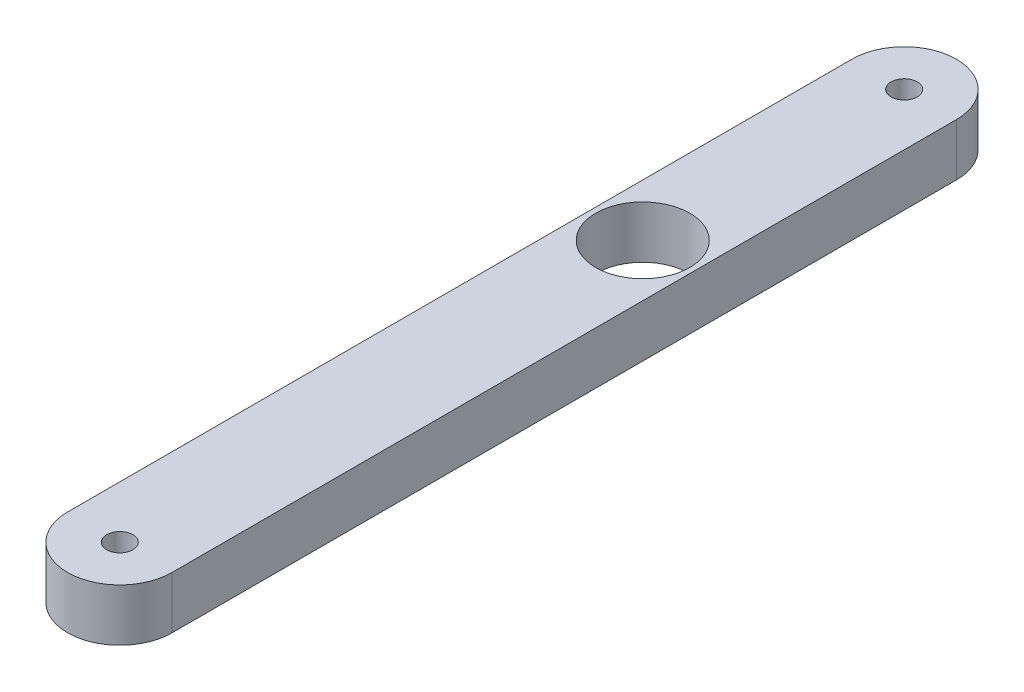
ISO-10303-21;
HEADER;
FILE_DESCRIPTION(('STEP AP214'),'2;1');
FILE_NAME('part.step','',(''),(''),'','','');
FILE_SCHEMA(('AUTOMOTIVE_DESIGN { 1 0 10303 214 1 1 1 1 }'));
ENDSEC;
DATA;
#1=APPLICATION_CONTEXT('core data for automotive mechanical design processes');
#2=APPLICATION_PROTOCOL_DEFINITION('international standard','automotive_design',2000,#1);
#3=PRODUCT_CONTEXT('',#1,'mechanical');
#4=PRODUCT('Part','Part','',(#3));
#5=PRODUCT_RELATED_PRODUCT_CATEGORY('part','',(#4));
#6=PRODUCT_DEFINITION_FORMATION('','',#4);
#7=PRODUCT_DEFINITION_CONTEXT('part definition',#1,'design');
#8=PRODUCT_DEFINITION('design','',#6,#7);
#9=PRODUCT_DEFINITION_SHAPE('','',#8);
#10=(LENGTH_UNIT() NAMED_UNIT(*) SI_UNIT(.MILLI.,.METRE.));
#11=(NAMED_UNIT(*) PLANE_ANGLE_UNIT() SI_UNIT($,.RADIAN.));
#12=(NAMED_UNIT(*) SI_UNIT($,.STERADIAN.) SOLID_ANGLE_UNIT());
#13=UNCERTAINTY_MEASURE_WITH_UNIT(LENGTH_MEASURE(1.E-05),#10,'distance_accuracy_value','');
#14=(GEOMETRIC_REPRESENTATION_CONTEXT(3) GLOBAL_UNCERTAINTY_ASSIGNED_CONTEXT((#13)) GLOBAL_UNIT_ASSIGNED_CONTEXT((#10,
#11,#12)) REPRESENTATION_CONTEXT('',''));
#15=CARTESIAN_POINT('',(0.,0.,0.));
#16=DIRECTION('',(0.,0.,1.));
#17=DIRECTION('',(1.,0.,0.));
#18=AXIS2_PLACEMENT_3D('',#15,#16,#17);
#19=CARTESIAN_POINT('',(10.,10.,0.));
#20=DIRECTION('',(-1.,0.,0.));
#21=DIRECTION('',(0.,0.,1.));
#22=AXIS2_PLACEMENT_3D('',#19,#20,#21);
#23=PLANE('',#22);
#24=DIRECTION('',(0.,0.,-1.));
#25=VECTOR('',#24,1.);
#26=CARTESIAN_POINT('',(10.,0.,0.));
#27=LINE('',#26,#25);
#28=CARTESIAN_POINT('',(10.,0.,75.));
#29=VERTEX_POINT('',#28);
#30=CARTESIAN_POINT('',(10.,0.,-75.));
#31=VERTEX_POINT('',#30);
#32=EDGE_CURVE('E106',#29,#31,#27,.T.);
#33=ORIENTED_EDGE('',*,*,#32,.T.);
#34=DIRECTION('',(0.,-1.,0.));
#35=VECTOR('',#34,1.);
#36=CARTESIAN_POINT('',(10.,10.,-75.));
#37=LINE('',#36,#35);
#38=CARTESIAN_POINT('',(10.,10.,-75.));
#39=VERTEX_POINT('',#38);
#40=EDGE_CURVE('E11',#39,#31,#37,.T.);
#41=ORIENTED_EDGE('',*,*,#40,.F.);
#42=DIRECTION('',(0.,0.,-1.));
#43=VECTOR('',#42,1.);
#44=CARTESIAN_POINT('',(10.,10.,0.));
#45=LINE('',#44,#43);
#46=CARTESIAN_POINT('',(10.,10.,75.));
#47=VERTEX_POINT('',#46);
#48=EDGE_CURVE('E86',#47,#39,#45,.T.);
#49=ORIENTED_EDGE('',*,*,#48,.F.);
#50=DIRECTION('',(0.,-1.,0.));
#51=VECTOR('',#50,1.);
#52=CARTESIAN_POINT('',(10.,10.,75.));
#53=LINE('',#52,#51);
#54=EDGE_CURVE('E52',#47,#29,#53,.T.);
#55=ORIENTED_EDGE('',*,*,#54,.T.);
#56=EDGE_LOOP('',(#33,#41,#49,#55));
#57=FACE_BOUND('',#56,.T.);
#58=ADVANCED_FACE('F35',(#57),#23,.F.);
#59=CARTESIAN_POINT('',(0.,10.,-75.));
#60=DIRECTION('',(0.,-1.,0.));
#61=DIRECTION('',(0.,0.,-1.));
#62=AXIS2_PLACEMENT_3D('',#59,#60,#61);
#63=CYLINDRICAL_SURFACE('',#62,10.);
#64=CARTESIAN_POINT('',(0.,0.,-75.));
#65=DIRECTION('',(0.,1.,0.));
#66=DIRECTION('',(0.,0.,1.));
#67=AXIS2_PLACEMENT_3D('',#64,#65,#66);
#68=CIRCLE('',#67,10.);
#69=CARTESIAN_POINT('',(-10.,0.,-75.));
#70=VERTEX_POINT('',#69);
#71=EDGE_CURVE('E91',#31,#70,#68,.T.);
#72=ORIENTED_EDGE('',*,*,#71,.T.);
#73=DIRECTION('',(0.,-1.,0.));
#74=VECTOR('',#73,1.);
#75=CARTESIAN_POINT('',(-10.,10.,-75.));
#76=LINE('',#75,#74);
#77=CARTESIAN_POINT('',(-10.,10.,-75.));
#78=VERTEX_POINT('',#77);
#79=EDGE_CURVE('E44',#78,#70,#76,.T.);
#80=ORIENTED_EDGE('',*,*,#79,.F.);
#81=CARTESIAN_POINT('',(0.,10.,-75.));
#82=DIRECTION('',(0.,1.,0.));
#83=DIRECTION('',(0.,0.,1.));
#84=AXIS2_PLACEMENT_3D('',#81,#82,#83);
#85=CIRCLE('',#84,10.);
#86=EDGE_CURVE('E77',#39,#78,#85,.T.);
#87=ORIENTED_EDGE('',*,*,#86,.F.);
#88=ORIENTED_EDGE('',*,*,#40,.T.);
#89=EDGE_LOOP('',(#72,#80,#87,#88));
#90=FACE_BOUND('',#89,.T.);
#91=ADVANCED_FACE('F90',(#90),#63,.T.);
#92=CARTESIAN_POINT('',(-10.,10.,0.));
#93=DIRECTION('',(-1.,0.,0.));
#94=DIRECTION('',(0.,0.,1.));
#95=AXIS2_PLACEMENT_3D('',#92,#93,#94);
#96=PLANE('',#95);
#97=DIRECTION('',(0.,0.,-1.));
#98=VECTOR('',#97,1.);
#99=CARTESIAN_POINT('',(-10.,0.,0.));
#100=LINE('',#99,#98);
#101=CARTESIAN_POINT('',(-10.,0.,75.));
#102=VERTEX_POINT('',#101);
#103=EDGE_CURVE('E110',#102,#70,#100,.T.);
#104=ORIENTED_EDGE('',*,*,#103,.F.);
#105=DIRECTION('',(0.,-1.,0.));
#106=VECTOR('',#105,1.);
#107=CARTESIAN_POINT('',(-10.,10.,75.));
#108=LINE('',#107,#106);
#109=CARTESIAN_POINT('',(-10.,10.,75.));
#110=VERTEX_POINT('',#109);
#111=EDGE_CURVE('E66',#110,#102,#108,.T.);
#112=ORIENTED_EDGE('',*,*,#111,.F.);
#113=DIRECTION('',(0.,0.,-1.));
#114=VECTOR('',#113,1.);
#115=CARTESIAN_POINT('',(-10.,10.,0.));
#116=LINE('',#115,#114);
#117=EDGE_CURVE('E85',#110,#78,#116,.T.);
#118=ORIENTED_EDGE('',*,*,#117,.T.);
#119=ORIENTED_EDGE('',*,*,#79,.T.);
#120=EDGE_LOOP('',(#104,#112,#118,#119));
#121=FACE_BOUND('',#120,.T.);
#122=ADVANCED_FACE('F94',(#121),#96,.T.);
#123=CARTESIAN_POINT('',(0.,10.,75.));
#124=DIRECTION('',(0.,-1.,0.));
#125=DIRECTION('',(0.,0.,-1.));
#126=AXIS2_PLACEMENT_3D('',#123,#124,#125);
#127=CYLINDRICAL_SURFACE('',#126,10.);
#128=CARTESIAN_POINT('',(0.,0.,75.));
#129=DIRECTION('',(0.,1.,0.));
#130=DIRECTION('',(0.,0.,1.));
#131=AXIS2_PLACEMENT_3D('',#128,#129,#130);
#132=CIRCLE('',#131,10.);
#133=EDGE_CURVE('E112',#29,#102,#132,.F.);
#134=ORIENTED_EDGE('',*,*,#133,.F.);
#135=ORIENTED_EDGE('',*,*,#54,.F.);
#136=CARTESIAN_POINT('',(0.,10.,75.));
#137=DIRECTION('',(0.,1.,0.));
#138=DIRECTION('',(0.,0.,1.));
#139=AXIS2_PLACEMENT_3D('',#136,#137,#138);
#140=CIRCLE('',#139,10.);
#141=EDGE_CURVE('E95',#47,#110,#140,.F.);
#142=ORIENTED_EDGE('',*,*,#141,.T.);
#143=ORIENTED_EDGE('',*,*,#111,.T.);
#144=EDGE_LOOP('',(#134,#135,#142,#143));
#145=FACE_BOUND('',#144,.T.);
#146=ADVANCED_FACE('F160',(#145),#127,.T.);
#147=CARTESIAN_POINT('',(0.,10.,75.));
#148=DIRECTION('',(0.,-1.,0.));
#149=DIRECTION('',(0.,0.,-1.));
#150=AXIS2_PLACEMENT_3D('',#147,#148,#149);
#151=CYLINDRICAL_SURFACE('',#150,2.50000000000001);
#152=CARTESIAN_POINT('',(0.,10.,75.));
#153=DIRECTION('',(0.,1.,0.));
#154=DIRECTION('',(0.,0.,1.));
#155=AXIS2_PLACEMENT_3D('',#152,#153,#154);
#156=CIRCLE('',#155,2.50000000000001);
#157=CARTESIAN_POINT('',(0.,10.,77.5));
#158=VERTEX_POINT('',#157);
#159=EDGE_CURVE('E118',#158,#158,#156,.F.);
#160=ORIENTED_EDGE('',*,*,#159,.F.);
#161=EDGE_LOOP('',(#160));
#162=FACE_BOUND('',#161,.T.);
#163=CARTESIAN_POINT('',(0.,0.,75.));
#164=DIRECTION('',(0.,1.,0.));
#165=DIRECTION('',(0.,0.,1.));
#166=AXIS2_PLACEMENT_3D('',#163,#164,#165);
#167=CIRCLE('',#166,2.50000000000001);
#168=CARTESIAN_POINT('',(0.,0.,77.5));
#169=VERTEX_POINT('',#168);
#170=EDGE_CURVE('E103',#169,#169,#167,.F.);
#171=ORIENTED_EDGE('',*,*,#170,.T.);
#172=EDGE_LOOP('',(#171));
#173=FACE_BOUND('',#172,.T.);
#174=ADVANCED_FACE('F37',(#162,#173),#151,.F.);
#175=CARTESIAN_POINT('',(0.,10.,-75.));
#176=DIRECTION('',(0.,-1.,0.));
#177=DIRECTION('',(0.,0.,-1.));
#178=AXIS2_PLACEMENT_3D('',#175,#176,#177);
#179=CYLINDRICAL_SURFACE('',#178,2.50000000000001);
#180=CARTESIAN_POINT('',(0.,10.,-75.));
#181=DIRECTION('',(0.,1.,0.));
#182=DIRECTION('',(0.,0.,1.));
#183=AXIS2_PLACEMENT_3D('',#180,#181,#182);
#184=CIRCLE('',#183,2.50000000000001);
#185=CARTESIAN_POINT('',(0.,10.,-72.5));
#186=VERTEX_POINT('',#185);
#187=EDGE_CURVE('E97',#186,#186,#184,.T.);
#188=ORIENTED_EDGE('',*,*,#187,.T.);
#189=EDGE_LOOP('',(#188));
#190=FACE_BOUND('',#189,.T.);
#191=CARTESIAN_POINT('',(0.,0.,-75.));
#192=DIRECTION('',(0.,1.,0.));
#193=DIRECTION('',(0.,0.,1.));
#194=AXIS2_PLACEMENT_3D('',#191,#192,#193);
#195=CIRCLE('',#194,2.50000000000001);
#196=CARTESIAN_POINT('',(0.,0.,-72.5));
#197=VERTEX_POINT('',#196);
#198=EDGE_CURVE('E115',#197,#197,#195,.T.);
#199=ORIENTED_EDGE('',*,*,#198,.F.);
#200=EDGE_LOOP('',(#199));
#201=FACE_BOUND('',#200,.T.);
#202=ADVANCED_FACE('F143',(#190,#201),#179,.F.);
#203=CARTESIAN_POINT('',(0.,10.,0.));
#204=DIRECTION('',(0.,1.,0.));
#205=DIRECTION('',(0.,0.,1.));
#206=AXIS2_PLACEMENT_3D('',#203,#204,#205);
#207=PLANE('',#206);
#208=CARTESIAN_POINT('',(0.,10.,-25.));
#209=DIRECTION('',(0.,1.,0.));
#210=DIRECTION('',(0.,0.,1.));
#211=AXIS2_PLACEMENT_3D('',#208,#209,#210);
#212=CIRCLE('',#211,9.);
#213=CARTESIAN_POINT('',(0.,10.,-16.));
#214=VERTEX_POINT('',#213);
#215=EDGE_CURVE('E127',#214,#214,#212,.T.);
#216=ORIENTED_EDGE('',*,*,#215,.F.);
#217=EDGE_LOOP('',(#216));
#218=FACE_BOUND('',#217,.T.);
#219=ORIENTED_EDGE('',*,*,#159,.T.);
#220=EDGE_LOOP('',(#219));
#221=FACE_BOUND('',#220,.T.);
#222=ORIENTED_EDGE('',*,*,#48,.T.);
#223=ORIENTED_EDGE('',*,*,#86,.T.);
#224=ORIENTED_EDGE('',*,*,#117,.F.);
#225=ORIENTED_EDGE('',*,*,#141,.F.);
#226=EDGE_LOOP('',(#222,#223,#224,#225));
#227=FACE_BOUND('',#226,.T.);
#228=ORIENTED_EDGE('',*,*,#187,.F.);
#229=EDGE_LOOP('',(#228));
#230=FACE_BOUND('',#229,.T.);
#231=ADVANCED_FACE('F81',(#218,#221,#227,#230),#207,.T.);
#232=CARTESIAN_POINT('',(0.,0.,0.));
#233=DIRECTION('',(0.,1.,0.));
#234=DIRECTION('',(0.,0.,1.));
#235=AXIS2_PLACEMENT_3D('',#232,#233,#234);
#236=PLANE('',#235);
#237=CARTESIAN_POINT('',(0.,0.,-25.));
#238=DIRECTION('',(0.,1.,0.));
#239=DIRECTION('',(0.,0.,1.));
#240=AXIS2_PLACEMENT_3D('',#237,#238,#239);
#241=CIRCLE('',#240,9.);
#242=CARTESIAN_POINT('',(0.,0.,-16.));
#243=VERTEX_POINT('',#242);
#244=EDGE_CURVE('E107',#243,#243,#241,.T.);
#245=ORIENTED_EDGE('',*,*,#244,.T.);
#246=EDGE_LOOP('',(#245));
#247=FACE_BOUND('',#246,.T.);
#248=ORIENTED_EDGE('',*,*,#170,.F.);
#249=EDGE_LOOP('',(#248));
#250=FACE_BOUND('',#249,.T.);
#251=ORIENTED_EDGE('',*,*,#32,.F.);
#252=ORIENTED_EDGE('',*,*,#133,.T.);
#253=ORIENTED_EDGE('',*,*,#103,.T.);
#254=ORIENTED_EDGE('',*,*,#71,.F.);
#255=EDGE_LOOP('',(#251,#252,#253,#254));
#256=FACE_BOUND('',#255,.T.);
#257=ORIENTED_EDGE('',*,*,#198,.T.);
#258=EDGE_LOOP('',(#257));
#259=FACE_BOUND('',#258,.T.);
#260=ADVANCED_FACE('F133',(#247,#250,#256,#259),#236,.F.);
#261=CARTESIAN_POINT('',(0.,0.,-25.));
#262=DIRECTION('',(0.,1.,0.));
#263=DIRECTION('',(0.,0.,1.));
#264=AXIS2_PLACEMENT_3D('',#261,#262,#263);
#265=CYLINDRICAL_SURFACE('',#264,9.);
#266=ORIENTED_EDGE('',*,*,#244,.F.);
#267=EDGE_LOOP('',(#266));
#268=FACE_BOUND('',#267,.T.);
#269=ORIENTED_EDGE('',*,*,#215,.T.);
#270=EDGE_LOOP('',(#269));
#271=FACE_BOUND('',#270,.T.);
#272=ADVANCED_FACE('F136',(#268,#271),#265,.F.);
#273=CLOSED_SHELL('',(#58,#91,#122,#146,#174,#202,#231,#260,#272));
#274=MANIFOLD_SOLID_BREP('B2',#273);
#275=ADVANCED_BREP_SHAPE_REPRESENTATION('',(#18,#274),#14);
#276=SHAPE_DEFINITION_REPRESENTATION(#9,#275);
ENDSEC;
END-ISO-10303-21;
